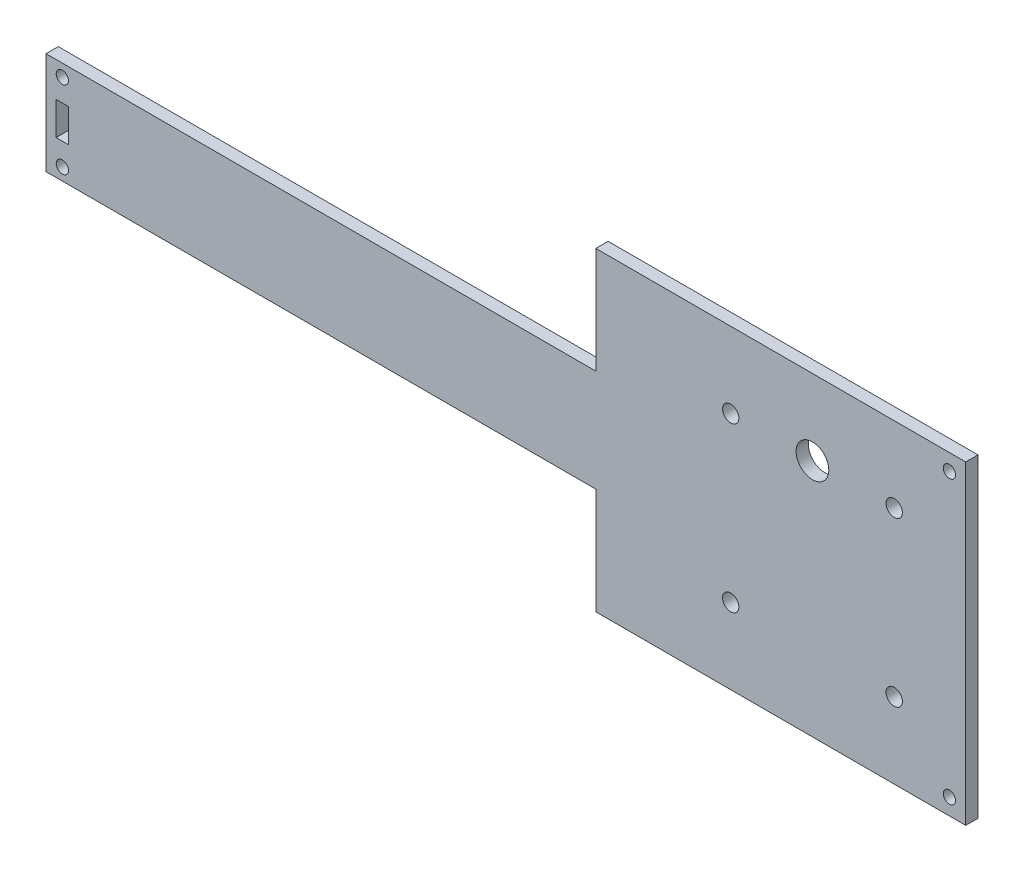
ISO-10303-21;
HEADER;
FILE_DESCRIPTION(('STEP AP214'),'2;1');
FILE_NAME('part.step','',(''),(''),'','','');
FILE_SCHEMA(('AUTOMOTIVE_DESIGN { 1 0 10303 214 1 1 1 1 }'));
ENDSEC;
DATA;
#1=APPLICATION_CONTEXT('core data for automotive mechanical design processes');
#2=APPLICATION_PROTOCOL_DEFINITION('international standard','automotive_design',2000,#1);
#3=PRODUCT_CONTEXT('',#1,'mechanical');
#4=PRODUCT('Part','Part','',(#3));
#5=PRODUCT_RELATED_PRODUCT_CATEGORY('part','',(#4));
#6=PRODUCT_DEFINITION_FORMATION('','',#4);
#7=PRODUCT_DEFINITION_CONTEXT('part definition',#1,'design');
#8=PRODUCT_DEFINITION('design','',#6,#7);
#9=PRODUCT_DEFINITION_SHAPE('','',#8);
#10=(LENGTH_UNIT() NAMED_UNIT(*) SI_UNIT(.MILLI.,.METRE.));
#11=(NAMED_UNIT(*) PLANE_ANGLE_UNIT() SI_UNIT($,.RADIAN.));
#12=(NAMED_UNIT(*) SI_UNIT($,.STERADIAN.) SOLID_ANGLE_UNIT());
#13=UNCERTAINTY_MEASURE_WITH_UNIT(LENGTH_MEASURE(1.E-05),#10,'distance_accuracy_value','');
#14=(GEOMETRIC_REPRESENTATION_CONTEXT(3) GLOBAL_UNCERTAINTY_ASSIGNED_CONTEXT((#13)) GLOBAL_UNIT_ASSIGNED_CONTEXT((#10,
#11,#12)) REPRESENTATION_CONTEXT('',''));
#15=CARTESIAN_POINT('',(0.,0.,0.));
#16=DIRECTION('',(0.,0.,1.));
#17=DIRECTION('',(1.,0.,0.));
#18=AXIS2_PLACEMENT_3D('',#15,#16,#17);
#19=CARTESIAN_POINT('',(0.,0.,3.));
#20=DIRECTION('',(0.,0.,-1.));
#21=DIRECTION('',(-1.,0.,0.));
#22=AXIS2_PLACEMENT_3D('',#19,#20,#21);
#23=PLANE('',#22);
#24=CARTESIAN_POINT('',(-5.65315315315298,7.11711711711692,3.));
#25=DIRECTION('',(0.,0.,1.));
#26=DIRECTION('',(1.,0.,0.));
#27=AXIS2_PLACEMENT_3D('',#24,#25,#26);
#28=CIRCLE('',#27,2.);
#29=CARTESIAN_POINT('',(-3.65315315315298,7.11711711711692,3.));
#30=VERTEX_POINT('',#29);
#31=EDGE_CURVE('E177',#30,#30,#28,.T.);
#32=ORIENTED_EDGE('',*,*,#31,.F.);
#33=EDGE_LOOP('',(#32));
#34=FACE_BOUND('',#33,.T.);
#35=CARTESIAN_POINT('',(-45.6531531531531,7.11711711711726,3.));
#36=DIRECTION('',(0.,0.,1.));
#37=DIRECTION('',(1.,0.,0.));
#38=AXIS2_PLACEMENT_3D('',#35,#36,#37);
#39=CIRCLE('',#38,2.00000000000001);
#40=CARTESIAN_POINT('',(-43.6531531531531,7.11711711711726,3.));
#41=VERTEX_POINT('',#40);
#42=EDGE_CURVE('E185',#41,#41,#39,.T.);
#43=ORIENTED_EDGE('',*,*,#42,.F.);
#44=EDGE_LOOP('',(#43));
#45=FACE_BOUND('',#44,.T.);
#46=CARTESIAN_POINT('',(-45.6531531531533,-32.8828828828828,3.));
#47=DIRECTION('',(0.,0.,1.));
#48=DIRECTION('',(1.,0.,0.));
#49=AXIS2_PLACEMENT_3D('',#46,#47,#48);
#50=CIRCLE('',#49,2.);
#51=CARTESIAN_POINT('',(-43.6531531531533,-32.8828828828828,3.));
#52=VERTEX_POINT('',#51);
#53=EDGE_CURVE('E193',#52,#52,#50,.T.);
#54=ORIENTED_EDGE('',*,*,#53,.F.);
#55=EDGE_LOOP('',(#54));
#56=FACE_BOUND('',#55,.T.);
#57=CARTESIAN_POINT('',(-25.653153153153,7.11711711711709,3.));
#58=DIRECTION('',(0.,0.,1.));
#59=DIRECTION('',(1.,0.,0.));
#60=AXIS2_PLACEMENT_3D('',#57,#58,#59);
#61=CIRCLE('',#60,4.);
#62=CARTESIAN_POINT('',(-21.653153153153,7.11711711711709,3.));
#63=VERTEX_POINT('',#62);
#64=EDGE_CURVE('E201',#63,#63,#61,.T.);
#65=ORIENTED_EDGE('',*,*,#64,.F.);
#66=EDGE_LOOP('',(#65));
#67=FACE_BOUND('',#66,.T.);
#68=CARTESIAN_POINT('',(-5.65315315315317,-32.8828828828829,3.));
#69=DIRECTION('',(0.,0.,1.));
#70=DIRECTION('',(1.,0.,0.));
#71=AXIS2_PLACEMENT_3D('',#68,#69,#70);
#72=CIRCLE('',#71,2.);
#73=CARTESIAN_POINT('',(-3.65315315315317,-32.8828828828829,3.));
#74=VERTEX_POINT('',#73);
#75=EDGE_CURVE('E209',#74,#74,#72,.T.);
#76=ORIENTED_EDGE('',*,*,#75,.F.);
#77=EDGE_LOOP('',(#76));
#78=FACE_BOUND('',#77,.T.);
#79=CARTESIAN_POINT('',(7.84684684684683,-47.3828828828829,3.));
#80=DIRECTION('',(0.,0.,1.));
#81=DIRECTION('',(1.,0.,0.));
#82=AXIS2_PLACEMENT_3D('',#79,#80,#81);
#83=CIRCLE('',#82,1.5);
#84=CARTESIAN_POINT('',(9.34684684684683,-47.3828828828829,3.));
#85=VERTEX_POINT('',#84);
#86=EDGE_CURVE('E217',#85,#85,#83,.T.);
#87=ORIENTED_EDGE('',*,*,#86,.F.);
#88=EDGE_LOOP('',(#87));
#89=FACE_BOUND('',#88,.T.);
#90=CARTESIAN_POINT('',(-209.153153153153,-22.3828828828829,3.));
#91=DIRECTION('',(0.,0.,1.));
#92=DIRECTION('',(1.,0.,0.));
#93=AXIS2_PLACEMENT_3D('',#90,#91,#92);
#94=CIRCLE('',#93,1.50000000000003);
#95=CARTESIAN_POINT('',(-207.653153153153,-22.3828828828829,3.));
#96=VERTEX_POINT('',#95);
#97=EDGE_CURVE('E225',#96,#96,#94,.T.);
#98=ORIENTED_EDGE('',*,*,#97,.F.);
#99=EDGE_LOOP('',(#98));
#100=FACE_BOUND('',#99,.T.);
#101=CARTESIAN_POINT('',(7.84684684684683,21.6171171171171,3.));
#102=DIRECTION('',(0.,0.,1.));
#103=DIRECTION('',(1.,0.,0.));
#104=AXIS2_PLACEMENT_3D('',#101,#102,#103);
#105=CIRCLE('',#104,1.5);
#106=CARTESIAN_POINT('',(9.34684684684683,21.6171171171171,3.));
#107=VERTEX_POINT('',#106);
#108=EDGE_CURVE('E233',#107,#107,#105,.T.);
#109=ORIENTED_EDGE('',*,*,#108,.F.);
#110=EDGE_LOOP('',(#109));
#111=FACE_BOUND('',#110,.T.);
#112=CARTESIAN_POINT('',(-209.153153153153,-3.38288288288287,3.));
#113=DIRECTION('',(0.,0.,1.));
#114=DIRECTION('',(1.,0.,0.));
#115=AXIS2_PLACEMENT_3D('',#112,#113,#114);
#116=CIRCLE('',#115,1.50000000000003);
#117=CARTESIAN_POINT('',(-207.653153153153,-3.38288288288287,3.));
#118=VERTEX_POINT('',#117);
#119=EDGE_CURVE('E241',#118,#118,#116,.T.);
#120=ORIENTED_EDGE('',*,*,#119,.F.);
#121=EDGE_LOOP('',(#120));
#122=FACE_BOUND('',#121,.T.);
#123=DIRECTION('',(-1.,0.,0.));
#124=VECTOR('',#123,1.);
#125=CARTESIAN_POINT('',(-78.6473174312547,25.6171171171171,3.));
#126=LINE('',#125,#124);
#127=CARTESIAN_POINT('',(11.8468468468468,25.6171171171171,3.));
#128=VERTEX_POINT('',#127);
#129=CARTESIAN_POINT('',(-78.6473174312547,25.6171171171171,3.));
#130=VERTEX_POINT('',#129);
#131=EDGE_CURVE('E249',#128,#130,#126,.T.);
#132=ORIENTED_EDGE('',*,*,#131,.T.);
#133=DIRECTION('',(0.,-1.,0.));
#134=VECTOR('',#133,1.);
#135=CARTESIAN_POINT('',(-78.6473174312547,-0.382882882882876,3.));
#136=LINE('',#135,#134);
#137=CARTESIAN_POINT('',(-78.6473174312547,-0.382882882882876,3.));
#138=VERTEX_POINT('',#137);
#139=EDGE_CURVE('E253',#130,#138,#136,.T.);
#140=ORIENTED_EDGE('',*,*,#139,.T.);
#141=DIRECTION('',(-1.,0.,0.));
#142=VECTOR('',#141,1.);
#143=CARTESIAN_POINT('',(-213.153153153153,-0.382882882882876,3.));
#144=LINE('',#143,#142);
#145=CARTESIAN_POINT('',(-213.153153153153,-0.382882882882876,3.));
#146=VERTEX_POINT('',#145);
#147=EDGE_CURVE('E257',#138,#146,#144,.T.);
#148=ORIENTED_EDGE('',*,*,#147,.T.);
#149=DIRECTION('',(0.,-1.,0.));
#150=VECTOR('',#149,1.);
#151=CARTESIAN_POINT('',(-213.153153153153,-25.3828828828829,3.));
#152=LINE('',#151,#150);
#153=CARTESIAN_POINT('',(-213.153153153153,-25.3828828828829,3.));
#154=VERTEX_POINT('',#153);
#155=EDGE_CURVE('E260',#146,#154,#152,.T.);
#156=ORIENTED_EDGE('',*,*,#155,.T.);
#157=DIRECTION('',(1.,0.,0.));
#158=VECTOR('',#157,1.);
#159=CARTESIAN_POINT('',(-213.153153153153,-25.3828828828829,3.));
#160=LINE('',#159,#158);
#161=CARTESIAN_POINT('',(-78.6473174312547,-25.3828828828829,3.));
#162=VERTEX_POINT('',#161);
#163=EDGE_CURVE('E263',#154,#162,#160,.T.);
#164=ORIENTED_EDGE('',*,*,#163,.T.);
#165=DIRECTION('',(0.,-1.,0.));
#166=VECTOR('',#165,1.);
#167=CARTESIAN_POINT('',(-78.6473174312547,-25.3828828828829,3.));
#168=LINE('',#167,#166);
#169=CARTESIAN_POINT('',(-78.6473174312547,-51.3828828828829,3.));
#170=VERTEX_POINT('',#169);
#171=EDGE_CURVE('E266',#162,#170,#168,.T.);
#172=ORIENTED_EDGE('',*,*,#171,.T.);
#173=DIRECTION('',(1.,0.,0.));
#174=VECTOR('',#173,1.);
#175=CARTESIAN_POINT('',(-78.6473174312547,-51.3828828828829,3.));
#176=LINE('',#175,#174);
#177=CARTESIAN_POINT('',(11.8468468468468,-51.3828828828829,3.));
#178=VERTEX_POINT('',#177);
#179=EDGE_CURVE('E269',#170,#178,#176,.T.);
#180=ORIENTED_EDGE('',*,*,#179,.T.);
#181=DIRECTION('',(0.,1.,0.));
#182=VECTOR('',#181,1.);
#183=CARTESIAN_POINT('',(11.8468468468468,25.6171171171171,3.));
#184=LINE('',#183,#182);
#185=EDGE_CURVE('E272',#178,#128,#184,.T.);
#186=ORIENTED_EDGE('',*,*,#185,.T.);
#187=EDGE_LOOP('',(#132,#140,#148,#156,#164,#172,#180,#186));
#188=FACE_BOUND('',#187,.T.);
#189=DIRECTION('',(0.,1.,0.));
#190=VECTOR('',#189,1.);
#191=CARTESIAN_POINT('',(-207.603153153153,-8.83288288288288,3.));
#192=LINE('',#191,#190);
#193=CARTESIAN_POINT('',(-207.603153153153,-16.9328828828829,3.));
#194=VERTEX_POINT('',#193);
#195=CARTESIAN_POINT('',(-207.603153153153,-8.83288288288288,3.));
#196=VERTEX_POINT('',#195);
#197=EDGE_CURVE('E129',#194,#196,#192,.T.);
#198=ORIENTED_EDGE('',*,*,#197,.F.);
#199=DIRECTION('',(1.,0.,0.));
#200=VECTOR('',#199,1.);
#201=CARTESIAN_POINT('',(-210.703153153153,-16.9328828828829,3.));
#202=LINE('',#201,#200);
#203=CARTESIAN_POINT('',(-210.703153153153,-16.9328828828829,3.));
#204=VERTEX_POINT('',#203);
#205=EDGE_CURVE('E155',#204,#194,#202,.T.);
#206=ORIENTED_EDGE('',*,*,#205,.F.);
#207=DIRECTION('',(0.,-1.,0.));
#208=VECTOR('',#207,1.);
#209=CARTESIAN_POINT('',(-210.703153153153,-8.83288288288288,3.));
#210=LINE('',#209,#208);
#211=CARTESIAN_POINT('',(-210.703153153153,-8.83288288288288,3.));
#212=VERTEX_POINT('',#211);
#213=EDGE_CURVE('E151',#212,#204,#210,.T.);
#214=ORIENTED_EDGE('',*,*,#213,.F.);
#215=DIRECTION('',(-1.,0.,0.));
#216=VECTOR('',#215,1.);
#217=CARTESIAN_POINT('',(-210.703153153153,-8.83288288288288,3.));
#218=LINE('',#217,#216);
#219=EDGE_CURVE('E138',#196,#212,#218,.T.);
#220=ORIENTED_EDGE('',*,*,#219,.F.);
#221=EDGE_LOOP('',(#198,#206,#214,#220));
#222=FACE_BOUND('',#221,.T.);
#223=ADVANCED_FACE('F39',(#34,#45,#56,#67,#78,#89,#100,#111,#122,#188,#222),#23,.F.);
#224=CARTESIAN_POINT('',(0.,0.,0.));
#225=DIRECTION('',(0.,0.,-1.));
#226=DIRECTION('',(-1.,0.,0.));
#227=AXIS2_PLACEMENT_3D('',#224,#225,#226);
#228=PLANE('',#227);
#229=CARTESIAN_POINT('',(-45.6531531531531,7.11711711711726,0.));
#230=DIRECTION('',(0.,0.,1.));
#231=DIRECTION('',(1.,0.,0.));
#232=AXIS2_PLACEMENT_3D('',#229,#230,#231);
#233=CIRCLE('',#232,2.00000000000001);
#234=CARTESIAN_POINT('',(-43.6531531531531,7.11711711711726,0.));
#235=VERTEX_POINT('',#234);
#236=EDGE_CURVE('E181',#235,#235,#233,.T.);
#237=ORIENTED_EDGE('',*,*,#236,.T.);
#238=EDGE_LOOP('',(#237));
#239=FACE_BOUND('',#238,.T.);
#240=CARTESIAN_POINT('',(-25.653153153153,7.11711711711709,0.));
#241=DIRECTION('',(0.,0.,1.));
#242=DIRECTION('',(1.,0.,0.));
#243=AXIS2_PLACEMENT_3D('',#240,#241,#242);
#244=CIRCLE('',#243,4.);
#245=CARTESIAN_POINT('',(-21.653153153153,7.11711711711709,0.));
#246=VERTEX_POINT('',#245);
#247=EDGE_CURVE('E197',#246,#246,#244,.T.);
#248=ORIENTED_EDGE('',*,*,#247,.T.);
#249=EDGE_LOOP('',(#248));
#250=FACE_BOUND('',#249,.T.);
#251=CARTESIAN_POINT('',(7.84684684684683,-47.3828828828829,0.));
#252=DIRECTION('',(0.,0.,1.));
#253=DIRECTION('',(1.,0.,0.));
#254=AXIS2_PLACEMENT_3D('',#251,#252,#253);
#255=CIRCLE('',#254,1.5);
#256=CARTESIAN_POINT('',(9.34684684684683,-47.3828828828829,0.));
#257=VERTEX_POINT('',#256);
#258=EDGE_CURVE('E213',#257,#257,#255,.T.);
#259=ORIENTED_EDGE('',*,*,#258,.T.);
#260=EDGE_LOOP('',(#259));
#261=FACE_BOUND('',#260,.T.);
#262=CARTESIAN_POINT('',(7.84684684684683,21.6171171171171,0.));
#263=DIRECTION('',(0.,0.,1.));
#264=DIRECTION('',(1.,0.,0.));
#265=AXIS2_PLACEMENT_3D('',#262,#263,#264);
#266=CIRCLE('',#265,1.5);
#267=CARTESIAN_POINT('',(9.34684684684683,21.6171171171171,0.));
#268=VERTEX_POINT('',#267);
#269=EDGE_CURVE('E229',#268,#268,#266,.T.);
#270=ORIENTED_EDGE('',*,*,#269,.T.);
#271=EDGE_LOOP('',(#270));
#272=FACE_BOUND('',#271,.T.);
#273=DIRECTION('',(-1.,0.,0.));
#274=VECTOR('',#273,1.);
#275=CARTESIAN_POINT('',(-78.6473174312547,25.6171171171171,0.));
#276=LINE('',#275,#274);
#277=CARTESIAN_POINT('',(11.8468468468468,25.6171171171171,0.));
#278=VERTEX_POINT('',#277);
#279=CARTESIAN_POINT('',(-78.6473174312547,25.6171171171171,0.));
#280=VERTEX_POINT('',#279);
#281=EDGE_CURVE('E245',#278,#280,#276,.T.);
#282=ORIENTED_EDGE('',*,*,#281,.F.);
#283=DIRECTION('',(0.,1.,0.));
#284=VECTOR('',#283,1.);
#285=CARTESIAN_POINT('',(11.8468468468468,25.6171171171171,0.));
#286=LINE('',#285,#284);
#287=CARTESIAN_POINT('',(11.8468468468468,-51.3828828828829,0.));
#288=VERTEX_POINT('',#287);
#289=EDGE_CURVE('E254',#288,#278,#286,.T.);
#290=ORIENTED_EDGE('',*,*,#289,.F.);
#291=DIRECTION('',(1.,0.,0.));
#292=VECTOR('',#291,1.);
#293=CARTESIAN_POINT('',(-78.6473174312547,-51.3828828828829,0.));
#294=LINE('',#293,#292);
#295=CARTESIAN_POINT('',(-78.6473174312547,-51.3828828828829,0.));
#296=VERTEX_POINT('',#295);
#297=EDGE_CURVE('E294',#296,#288,#294,.T.);
#298=ORIENTED_EDGE('',*,*,#297,.F.);
#299=DIRECTION('',(0.,-1.,0.));
#300=VECTOR('',#299,1.);
#301=CARTESIAN_POINT('',(-78.6473174312547,-25.3828828828829,0.));
#302=LINE('',#301,#300);
#303=CARTESIAN_POINT('',(-78.6473174312547,-25.3828828828829,0.));
#304=VERTEX_POINT('',#303);
#305=EDGE_CURVE('E291',#304,#296,#302,.T.);
#306=ORIENTED_EDGE('',*,*,#305,.F.);
#307=DIRECTION('',(1.,0.,0.));
#308=VECTOR('',#307,1.);
#309=CARTESIAN_POINT('',(-213.153153153153,-25.3828828828829,0.));
#310=LINE('',#309,#308);
#311=CARTESIAN_POINT('',(-213.153153153153,-25.3828828828829,0.));
#312=VERTEX_POINT('',#311);
#313=EDGE_CURVE('E288',#312,#304,#310,.T.);
#314=ORIENTED_EDGE('',*,*,#313,.F.);
#315=DIRECTION('',(0.,-1.,0.));
#316=VECTOR('',#315,1.);
#317=CARTESIAN_POINT('',(-213.153153153153,-25.3828828828829,0.));
#318=LINE('',#317,#316);
#319=CARTESIAN_POINT('',(-213.153153153153,-0.382882882882876,0.));
#320=VERTEX_POINT('',#319);
#321=EDGE_CURVE('E285',#320,#312,#318,.T.);
#322=ORIENTED_EDGE('',*,*,#321,.F.);
#323=DIRECTION('',(-1.,0.,0.));
#324=VECTOR('',#323,1.);
#325=CARTESIAN_POINT('',(-213.153153153153,-0.382882882882876,0.));
#326=LINE('',#325,#324);
#327=CARTESIAN_POINT('',(-78.6473174312547,-0.382882882882876,0.));
#328=VERTEX_POINT('',#327);
#329=EDGE_CURVE('E282',#328,#320,#326,.T.);
#330=ORIENTED_EDGE('',*,*,#329,.F.);
#331=DIRECTION('',(0.,-1.,0.));
#332=VECTOR('',#331,1.);
#333=CARTESIAN_POINT('',(-78.6473174312547,-0.382882882882876,0.));
#334=LINE('',#333,#332);
#335=EDGE_CURVE('E279',#280,#328,#334,.T.);
#336=ORIENTED_EDGE('',*,*,#335,.F.);
#337=EDGE_LOOP('',(#282,#290,#298,#306,#314,#322,#330,#336));
#338=FACE_BOUND('',#337,.T.);
#339=CARTESIAN_POINT('',(-209.153153153153,-3.38288288288287,0.));
#340=DIRECTION('',(0.,0.,1.));
#341=DIRECTION('',(1.,0.,0.));
#342=AXIS2_PLACEMENT_3D('',#339,#340,#341);
#343=CIRCLE('',#342,1.50000000000003);
#344=CARTESIAN_POINT('',(-207.653153153153,-3.38288288288287,0.));
#345=VERTEX_POINT('',#344);
#346=EDGE_CURVE('E237',#345,#345,#343,.T.);
#347=ORIENTED_EDGE('',*,*,#346,.T.);
#348=EDGE_LOOP('',(#347));
#349=FACE_BOUND('',#348,.T.);
#350=CARTESIAN_POINT('',(-209.153153153153,-22.3828828828829,0.));
#351=DIRECTION('',(0.,0.,1.));
#352=DIRECTION('',(1.,0.,0.));
#353=AXIS2_PLACEMENT_3D('',#350,#351,#352);
#354=CIRCLE('',#353,1.50000000000003);
#355=CARTESIAN_POINT('',(-207.653153153153,-22.3828828828829,0.));
#356=VERTEX_POINT('',#355);
#357=EDGE_CURVE('E221',#356,#356,#354,.T.);
#358=ORIENTED_EDGE('',*,*,#357,.T.);
#359=EDGE_LOOP('',(#358));
#360=FACE_BOUND('',#359,.T.);
#361=CARTESIAN_POINT('',(-5.65315315315317,-32.8828828828829,0.));
#362=DIRECTION('',(0.,0.,1.));
#363=DIRECTION('',(1.,0.,0.));
#364=AXIS2_PLACEMENT_3D('',#361,#362,#363);
#365=CIRCLE('',#364,2.);
#366=CARTESIAN_POINT('',(-3.65315315315317,-32.8828828828829,0.));
#367=VERTEX_POINT('',#366);
#368=EDGE_CURVE('E205',#367,#367,#365,.T.);
#369=ORIENTED_EDGE('',*,*,#368,.T.);
#370=EDGE_LOOP('',(#369));
#371=FACE_BOUND('',#370,.T.);
#372=CARTESIAN_POINT('',(-45.6531531531533,-32.8828828828828,0.));
#373=DIRECTION('',(0.,0.,1.));
#374=DIRECTION('',(1.,0.,0.));
#375=AXIS2_PLACEMENT_3D('',#372,#373,#374);
#376=CIRCLE('',#375,2.);
#377=CARTESIAN_POINT('',(-43.6531531531533,-32.8828828828828,0.));
#378=VERTEX_POINT('',#377);
#379=EDGE_CURVE('E189',#378,#378,#376,.T.);
#380=ORIENTED_EDGE('',*,*,#379,.T.);
#381=EDGE_LOOP('',(#380));
#382=FACE_BOUND('',#381,.T.);
#383=CARTESIAN_POINT('',(-5.65315315315298,7.11711711711692,0.));
#384=DIRECTION('',(0.,0.,1.));
#385=DIRECTION('',(1.,0.,0.));
#386=AXIS2_PLACEMENT_3D('',#383,#384,#385);
#387=CIRCLE('',#386,2.);
#388=CARTESIAN_POINT('',(-3.65315315315298,7.11711711711692,0.));
#389=VERTEX_POINT('',#388);
#390=EDGE_CURVE('E147',#389,#389,#387,.T.);
#391=ORIENTED_EDGE('',*,*,#390,.T.);
#392=EDGE_LOOP('',(#391));
#393=FACE_BOUND('',#392,.T.);
#394=DIRECTION('',(1.,0.,0.));
#395=VECTOR('',#394,1.);
#396=CARTESIAN_POINT('',(-210.703153153153,-16.9328828828829,0.));
#397=LINE('',#396,#395);
#398=CARTESIAN_POINT('',(-210.703153153153,-16.9328828828829,0.));
#399=VERTEX_POINT('',#398);
#400=CARTESIAN_POINT('',(-207.603153153153,-16.9328828828829,0.));
#401=VERTEX_POINT('',#400);
#402=EDGE_CURVE('E139',#399,#401,#397,.T.);
#403=ORIENTED_EDGE('',*,*,#402,.T.);
#404=DIRECTION('',(0.,1.,0.));
#405=VECTOR('',#404,1.);
#406=CARTESIAN_POINT('',(-207.603153153153,-8.83288288288288,0.));
#407=LINE('',#406,#405);
#408=CARTESIAN_POINT('',(-207.603153153153,-8.83288288288288,0.));
#409=VERTEX_POINT('',#408);
#410=EDGE_CURVE('E63',#401,#409,#407,.T.);
#411=ORIENTED_EDGE('',*,*,#410,.T.);
#412=DIRECTION('',(-1.,0.,0.));
#413=VECTOR('',#412,1.);
#414=CARTESIAN_POINT('',(-210.703153153153,-8.83288288288288,0.));
#415=LINE('',#414,#413);
#416=CARTESIAN_POINT('',(-210.703153153153,-8.83288288288288,0.));
#417=VERTEX_POINT('',#416);
#418=EDGE_CURVE('E145',#409,#417,#415,.T.);
#419=ORIENTED_EDGE('',*,*,#418,.T.);
#420=DIRECTION('',(0.,-1.,0.));
#421=VECTOR('',#420,1.);
#422=CARTESIAN_POINT('',(-210.703153153153,-8.83288288288288,0.));
#423=LINE('',#422,#421);
#424=EDGE_CURVE('E164',#417,#399,#423,.T.);
#425=ORIENTED_EDGE('',*,*,#424,.T.);
#426=EDGE_LOOP('',(#403,#411,#419,#425));
#427=FACE_BOUND('',#426,.T.);
#428=ADVANCED_FACE('F333',(#239,#250,#261,#272,#338,#349,#360,#371,#382,#393,#427),#228,.T.);
#429=CARTESIAN_POINT('',(-78.6473174312547,25.6171171171171,3.));
#430=DIRECTION('',(0.,-1.,0.));
#431=DIRECTION('',(0.,0.,-1.));
#432=AXIS2_PLACEMENT_3D('',#429,#430,#431);
#433=PLANE('',#432);
#434=ORIENTED_EDGE('',*,*,#281,.T.);
#435=DIRECTION('',(0.,0.,-1.));
#436=VECTOR('',#435,1.);
#437=CARTESIAN_POINT('',(-78.6473174312547,25.6171171171171,3.));
#438=LINE('',#437,#436);
#439=EDGE_CURVE('E11',#130,#280,#438,.T.);
#440=ORIENTED_EDGE('',*,*,#439,.F.);
#441=ORIENTED_EDGE('',*,*,#131,.F.);
#442=DIRECTION('',(0.,0.,-1.));
#443=VECTOR('',#442,1.);
#444=CARTESIAN_POINT('',(11.8468468468468,25.6171171171171,3.));
#445=LINE('',#444,#443);
#446=EDGE_CURVE('E275',#128,#278,#445,.T.);
#447=ORIENTED_EDGE('',*,*,#446,.T.);
#448=EDGE_LOOP('',(#434,#440,#441,#447));
#449=FACE_BOUND('',#448,.T.);
#450=ADVANCED_FACE('F41',(#449),#433,.F.);
#451=CARTESIAN_POINT('',(-78.6473174312547,-0.382882882882876,3.));
#452=DIRECTION('',(1.,0.,0.));
#453=DIRECTION('',(0.,0.,-1.));
#454=AXIS2_PLACEMENT_3D('',#451,#452,#453);
#455=PLANE('',#454);
#456=ORIENTED_EDGE('',*,*,#335,.T.);
#457=DIRECTION('',(0.,0.,-1.));
#458=VECTOR('',#457,1.);
#459=CARTESIAN_POINT('',(-78.6473174312547,-0.382882882882876,3.));
#460=LINE('',#459,#458);
#461=EDGE_CURVE('E48',#138,#328,#460,.T.);
#462=ORIENTED_EDGE('',*,*,#461,.F.);
#463=ORIENTED_EDGE('',*,*,#139,.F.);
#464=ORIENTED_EDGE('',*,*,#439,.T.);
#465=EDGE_LOOP('',(#456,#462,#463,#464));
#466=FACE_BOUND('',#465,.T.);
#467=ADVANCED_FACE('F350',(#466),#455,.F.);
#468=CARTESIAN_POINT('',(-213.153153153153,-0.382882882882876,3.));
#469=DIRECTION('',(0.,-1.,0.));
#470=DIRECTION('',(0.,0.,-1.));
#471=AXIS2_PLACEMENT_3D('',#468,#469,#470);
#472=PLANE('',#471);
#473=ORIENTED_EDGE('',*,*,#329,.T.);
#474=DIRECTION('',(0.,0.,-1.));
#475=VECTOR('',#474,1.);
#476=CARTESIAN_POINT('',(-213.153153153153,-0.382882882882876,3.));
#477=LINE('',#476,#475);
#478=EDGE_CURVE('E318',#146,#320,#477,.T.);
#479=ORIENTED_EDGE('',*,*,#478,.F.);
#480=ORIENTED_EDGE('',*,*,#147,.F.);
#481=ORIENTED_EDGE('',*,*,#461,.T.);
#482=EDGE_LOOP('',(#473,#479,#480,#481));
#483=FACE_BOUND('',#482,.T.);
#484=ADVANCED_FACE('F327',(#483),#472,.F.);
#485=CARTESIAN_POINT('',(-213.153153153153,-25.3828828828829,3.));
#486=DIRECTION('',(1.,0.,0.));
#487=DIRECTION('',(0.,0.,-1.));
#488=AXIS2_PLACEMENT_3D('',#485,#486,#487);
#489=PLANE('',#488);
#490=ORIENTED_EDGE('',*,*,#321,.T.);
#491=DIRECTION('',(0.,0.,-1.));
#492=VECTOR('',#491,1.);
#493=CARTESIAN_POINT('',(-213.153153153153,-25.3828828828829,3.));
#494=LINE('',#493,#492);
#495=EDGE_CURVE('E314',#154,#312,#494,.T.);
#496=ORIENTED_EDGE('',*,*,#495,.F.);
#497=ORIENTED_EDGE('',*,*,#155,.F.);
#498=ORIENTED_EDGE('',*,*,#478,.T.);
#499=EDGE_LOOP('',(#490,#496,#497,#498));
#500=FACE_BOUND('',#499,.T.);
#501=ADVANCED_FACE('F339',(#500),#489,.F.);
#502=CARTESIAN_POINT('',(-213.153153153153,-25.3828828828829,3.));
#503=DIRECTION('',(0.,1.,0.));
#504=DIRECTION('',(0.,0.,1.));
#505=AXIS2_PLACEMENT_3D('',#502,#503,#504);
#506=PLANE('',#505);
#507=ORIENTED_EDGE('',*,*,#313,.T.);
#508=DIRECTION('',(0.,0.,-1.));
#509=VECTOR('',#508,1.);
#510=CARTESIAN_POINT('',(-78.6473174312547,-25.3828828828829,3.));
#511=LINE('',#510,#509);
#512=EDGE_CURVE('E310',#162,#304,#511,.T.);
#513=ORIENTED_EDGE('',*,*,#512,.F.);
#514=ORIENTED_EDGE('',*,*,#163,.F.);
#515=ORIENTED_EDGE('',*,*,#495,.T.);
#516=EDGE_LOOP('',(#507,#513,#514,#515));
#517=FACE_BOUND('',#516,.T.);
#518=ADVANCED_FACE('F343',(#517),#506,.F.);
#519=CARTESIAN_POINT('',(-78.6473174312547,-25.3828828828829,3.));
#520=DIRECTION('',(1.,0.,0.));
#521=DIRECTION('',(0.,0.,-1.));
#522=AXIS2_PLACEMENT_3D('',#519,#520,#521);
#523=PLANE('',#522);
#524=ORIENTED_EDGE('',*,*,#305,.T.);
#525=DIRECTION('',(0.,0.,-1.));
#526=VECTOR('',#525,1.);
#527=CARTESIAN_POINT('',(-78.6473174312547,-51.3828828828829,3.));
#528=LINE('',#527,#526);
#529=EDGE_CURVE('E306',#170,#296,#528,.T.);
#530=ORIENTED_EDGE('',*,*,#529,.F.);
#531=ORIENTED_EDGE('',*,*,#171,.F.);
#532=ORIENTED_EDGE('',*,*,#512,.T.);
#533=EDGE_LOOP('',(#524,#530,#531,#532));
#534=FACE_BOUND('',#533,.T.);
#535=ADVANCED_FACE('F363',(#534),#523,.F.);
#536=CARTESIAN_POINT('',(-78.6473174312547,-51.3828828828829,3.));
#537=DIRECTION('',(0.,1.,0.));
#538=DIRECTION('',(0.,0.,1.));
#539=AXIS2_PLACEMENT_3D('',#536,#537,#538);
#540=PLANE('',#539);
#541=ORIENTED_EDGE('',*,*,#297,.T.);
#542=DIRECTION('',(0.,0.,-1.));
#543=VECTOR('',#542,1.);
#544=CARTESIAN_POINT('',(11.8468468468468,-51.3828828828829,3.));
#545=LINE('',#544,#543);
#546=EDGE_CURVE('E302',#178,#288,#545,.T.);
#547=ORIENTED_EDGE('',*,*,#546,.F.);
#548=ORIENTED_EDGE('',*,*,#179,.F.);
#549=ORIENTED_EDGE('',*,*,#529,.T.);
#550=EDGE_LOOP('',(#541,#547,#548,#549));
#551=FACE_BOUND('',#550,.T.);
#552=ADVANCED_FACE('F361',(#551),#540,.F.);
#553=CARTESIAN_POINT('',(11.8468468468468,25.6171171171171,3.));
#554=DIRECTION('',(-1.,0.,0.));
#555=DIRECTION('',(0.,0.,1.));
#556=AXIS2_PLACEMENT_3D('',#553,#554,#555);
#557=PLANE('',#556);
#558=ORIENTED_EDGE('',*,*,#289,.T.);
#559=ORIENTED_EDGE('',*,*,#446,.F.);
#560=ORIENTED_EDGE('',*,*,#185,.F.);
#561=ORIENTED_EDGE('',*,*,#546,.T.);
#562=EDGE_LOOP('',(#558,#559,#560,#561));
#563=FACE_BOUND('',#562,.T.);
#564=ADVANCED_FACE('F356',(#563),#557,.F.);
#565=CARTESIAN_POINT('',(-209.153153153153,-3.38288288288287,3.));
#566=DIRECTION('',(0.,0.,-1.));
#567=DIRECTION('',(-1.,0.,0.));
#568=AXIS2_PLACEMENT_3D('',#565,#566,#567);
#569=CYLINDRICAL_SURFACE('',#568,1.50000000000003);
#570=ORIENTED_EDGE('',*,*,#119,.T.);
#571=EDGE_LOOP('',(#570));
#572=FACE_BOUND('',#571,.T.);
#573=ORIENTED_EDGE('',*,*,#346,.F.);
#574=EDGE_LOOP('',(#573));
#575=FACE_BOUND('',#574,.T.);
#576=ADVANCED_FACE('F383',(#572,#575),#569,.F.);
#577=CARTESIAN_POINT('',(7.84684684684683,21.6171171171171,3.));
#578=DIRECTION('',(0.,0.,-1.));
#579=DIRECTION('',(-1.,0.,0.));
#580=AXIS2_PLACEMENT_3D('',#577,#578,#579);
#581=CYLINDRICAL_SURFACE('',#580,1.5);
#582=ORIENTED_EDGE('',*,*,#108,.T.);
#583=EDGE_LOOP('',(#582));
#584=FACE_BOUND('',#583,.T.);
#585=ORIENTED_EDGE('',*,*,#269,.F.);
#586=EDGE_LOOP('',(#585));
#587=FACE_BOUND('',#586,.T.);
#588=ADVANCED_FACE('F390',(#584,#587),#581,.F.);
#589=CARTESIAN_POINT('',(-209.153153153153,-22.3828828828829,3.));
#590=DIRECTION('',(0.,0.,-1.));
#591=DIRECTION('',(-1.,0.,0.));
#592=AXIS2_PLACEMENT_3D('',#589,#590,#591);
#593=CYLINDRICAL_SURFACE('',#592,1.50000000000003);
#594=ORIENTED_EDGE('',*,*,#97,.T.);
#595=EDGE_LOOP('',(#594));
#596=FACE_BOUND('',#595,.T.);
#597=ORIENTED_EDGE('',*,*,#357,.F.);
#598=EDGE_LOOP('',(#597));
#599=FACE_BOUND('',#598,.T.);
#600=ADVANCED_FACE('F395',(#596,#599),#593,.F.);
#601=CARTESIAN_POINT('',(7.84684684684683,-47.3828828828829,3.));
#602=DIRECTION('',(0.,0.,-1.));
#603=DIRECTION('',(-1.,0.,0.));
#604=AXIS2_PLACEMENT_3D('',#601,#602,#603);
#605=CYLINDRICAL_SURFACE('',#604,1.5);
#606=ORIENTED_EDGE('',*,*,#86,.T.);
#607=EDGE_LOOP('',(#606));
#608=FACE_BOUND('',#607,.T.);
#609=ORIENTED_EDGE('',*,*,#258,.F.);
#610=EDGE_LOOP('',(#609));
#611=FACE_BOUND('',#610,.T.);
#612=ADVANCED_FACE('F443',(#608,#611),#605,.F.);
#613=CARTESIAN_POINT('',(-5.65315315315317,-32.8828828828829,3.));
#614=DIRECTION('',(0.,0.,-1.));
#615=DIRECTION('',(-1.,0.,0.));
#616=AXIS2_PLACEMENT_3D('',#613,#614,#615);
#617=CYLINDRICAL_SURFACE('',#616,2.);
#618=ORIENTED_EDGE('',*,*,#75,.T.);
#619=EDGE_LOOP('',(#618));
#620=FACE_BOUND('',#619,.T.);
#621=ORIENTED_EDGE('',*,*,#368,.F.);
#622=EDGE_LOOP('',(#621));
#623=FACE_BOUND('',#622,.T.);
#624=ADVANCED_FACE('F439',(#620,#623),#617,.F.);
#625=CARTESIAN_POINT('',(-25.653153153153,7.11711711711709,3.));
#626=DIRECTION('',(0.,0.,-1.));
#627=DIRECTION('',(-1.,0.,0.));
#628=AXIS2_PLACEMENT_3D('',#625,#626,#627);
#629=CYLINDRICAL_SURFACE('',#628,4.);
#630=ORIENTED_EDGE('',*,*,#64,.T.);
#631=EDGE_LOOP('',(#630));
#632=FACE_BOUND('',#631,.T.);
#633=ORIENTED_EDGE('',*,*,#247,.F.);
#634=EDGE_LOOP('',(#633));
#635=FACE_BOUND('',#634,.T.);
#636=ADVANCED_FACE('F435',(#632,#635),#629,.F.);
#637=CARTESIAN_POINT('',(-45.6531531531533,-32.8828828828828,3.));
#638=DIRECTION('',(0.,0.,-1.));
#639=DIRECTION('',(-1.,0.,0.));
#640=AXIS2_PLACEMENT_3D('',#637,#638,#639);
#641=CYLINDRICAL_SURFACE('',#640,2.);
#642=ORIENTED_EDGE('',*,*,#53,.T.);
#643=EDGE_LOOP('',(#642));
#644=FACE_BOUND('',#643,.T.);
#645=ORIENTED_EDGE('',*,*,#379,.F.);
#646=EDGE_LOOP('',(#645));
#647=FACE_BOUND('',#646,.T.);
#648=ADVANCED_FACE('F431',(#644,#647),#641,.F.);
#649=CARTESIAN_POINT('',(-45.6531531531531,7.11711711711726,3.));
#650=DIRECTION('',(0.,0.,-1.));
#651=DIRECTION('',(-1.,0.,0.));
#652=AXIS2_PLACEMENT_3D('',#649,#650,#651);
#653=CYLINDRICAL_SURFACE('',#652,2.00000000000001);
#654=ORIENTED_EDGE('',*,*,#42,.T.);
#655=EDGE_LOOP('',(#654));
#656=FACE_BOUND('',#655,.T.);
#657=ORIENTED_EDGE('',*,*,#236,.F.);
#658=EDGE_LOOP('',(#657));
#659=FACE_BOUND('',#658,.T.);
#660=ADVANCED_FACE('F427',(#656,#659),#653,.F.);
#661=CARTESIAN_POINT('',(-5.65315315315298,7.11711711711692,3.));
#662=DIRECTION('',(0.,0.,-1.));
#663=DIRECTION('',(-1.,0.,0.));
#664=AXIS2_PLACEMENT_3D('',#661,#662,#663);
#665=CYLINDRICAL_SURFACE('',#664,2.);
#666=ORIENTED_EDGE('',*,*,#31,.T.);
#667=EDGE_LOOP('',(#666));
#668=FACE_BOUND('',#667,.T.);
#669=ORIENTED_EDGE('',*,*,#390,.F.);
#670=EDGE_LOOP('',(#669));
#671=FACE_BOUND('',#670,.T.);
#672=ADVANCED_FACE('F424',(#668,#671),#665,.F.);
#673=CARTESIAN_POINT('',(-207.603153153153,-8.83288288288288,3.));
#674=DIRECTION('',(-1.,0.,0.));
#675=DIRECTION('',(0.,0.,1.));
#676=AXIS2_PLACEMENT_3D('',#673,#674,#675);
#677=PLANE('',#676);
#678=ORIENTED_EDGE('',*,*,#410,.F.);
#679=DIRECTION('',(0.,0.,-1.));
#680=VECTOR('',#679,1.);
#681=CARTESIAN_POINT('',(-207.603153153153,-16.9328828828829,3.));
#682=LINE('',#681,#680);
#683=EDGE_CURVE('E133',#194,#401,#682,.T.);
#684=ORIENTED_EDGE('',*,*,#683,.F.);
#685=ORIENTED_EDGE('',*,*,#197,.T.);
#686=DIRECTION('',(0.,0.,-1.));
#687=VECTOR('',#686,1.);
#688=CARTESIAN_POINT('',(-207.603153153153,-8.83288288288288,3.));
#689=LINE('',#688,#687);
#690=EDGE_CURVE('E132',#196,#409,#689,.T.);
#691=ORIENTED_EDGE('',*,*,#690,.T.);
#692=EDGE_LOOP('',(#678,#684,#685,#691));
#693=FACE_BOUND('',#692,.T.);
#694=ADVANCED_FACE('F131',(#693),#677,.T.);
#695=CARTESIAN_POINT('',(-210.703153153153,-8.83288288288288,3.));
#696=DIRECTION('',(0.,-1.,0.));
#697=DIRECTION('',(0.,0.,-1.));
#698=AXIS2_PLACEMENT_3D('',#695,#696,#697);
#699=PLANE('',#698);
#700=ORIENTED_EDGE('',*,*,#418,.F.);
#701=ORIENTED_EDGE('',*,*,#690,.F.);
#702=ORIENTED_EDGE('',*,*,#219,.T.);
#703=DIRECTION('',(0.,0.,-1.));
#704=VECTOR('',#703,1.);
#705=CARTESIAN_POINT('',(-210.703153153153,-8.83288288288288,3.));
#706=LINE('',#705,#704);
#707=EDGE_CURVE('E148',#212,#417,#706,.T.);
#708=ORIENTED_EDGE('',*,*,#707,.T.);
#709=EDGE_LOOP('',(#700,#701,#702,#708));
#710=FACE_BOUND('',#709,.T.);
#711=ADVANCED_FACE('F142',(#710),#699,.T.);
#712=CARTESIAN_POINT('',(-210.703153153153,-8.83288288288288,3.));
#713=DIRECTION('',(1.,0.,0.));
#714=DIRECTION('',(0.,0.,-1.));
#715=AXIS2_PLACEMENT_3D('',#712,#713,#714);
#716=PLANE('',#715);
#717=ORIENTED_EDGE('',*,*,#424,.F.);
#718=ORIENTED_EDGE('',*,*,#707,.F.);
#719=ORIENTED_EDGE('',*,*,#213,.T.);
#720=DIRECTION('',(0.,0.,-1.));
#721=VECTOR('',#720,1.);
#722=CARTESIAN_POINT('',(-210.703153153153,-16.9328828828829,3.));
#723=LINE('',#722,#721);
#724=EDGE_CURVE('E55',#204,#399,#723,.T.);
#725=ORIENTED_EDGE('',*,*,#724,.T.);
#726=EDGE_LOOP('',(#717,#718,#719,#725));
#727=FACE_BOUND('',#726,.T.);
#728=ADVANCED_FACE('F412',(#727),#716,.T.);
#729=CARTESIAN_POINT('',(-210.703153153153,-16.9328828828829,3.));
#730=DIRECTION('',(0.,1.,0.));
#731=DIRECTION('',(0.,0.,1.));
#732=AXIS2_PLACEMENT_3D('',#729,#730,#731);
#733=PLANE('',#732);
#734=ORIENTED_EDGE('',*,*,#402,.F.);
#735=ORIENTED_EDGE('',*,*,#724,.F.);
#736=ORIENTED_EDGE('',*,*,#205,.T.);
#737=ORIENTED_EDGE('',*,*,#683,.T.);
#738=EDGE_LOOP('',(#734,#735,#736,#737));
#739=FACE_BOUND('',#738,.T.);
#740=ADVANCED_FACE('F410',(#739),#733,.T.);
#741=CLOSED_SHELL('',(#223,#428,#450,#467,#484,#501,#518,#535,#552,#564,#576,#588,#600,#612,
#624,#636,#648,#660,#672,#694,#711,#728,#740));
#742=MANIFOLD_SOLID_BREP('B2',#741);
#743=ADVANCED_BREP_SHAPE_REPRESENTATION('',(#18,#742),#14);
#744=SHAPE_DEFINITION_REPRESENTATION(#9,#743);
ENDSEC;
END-ISO-10303-21;
